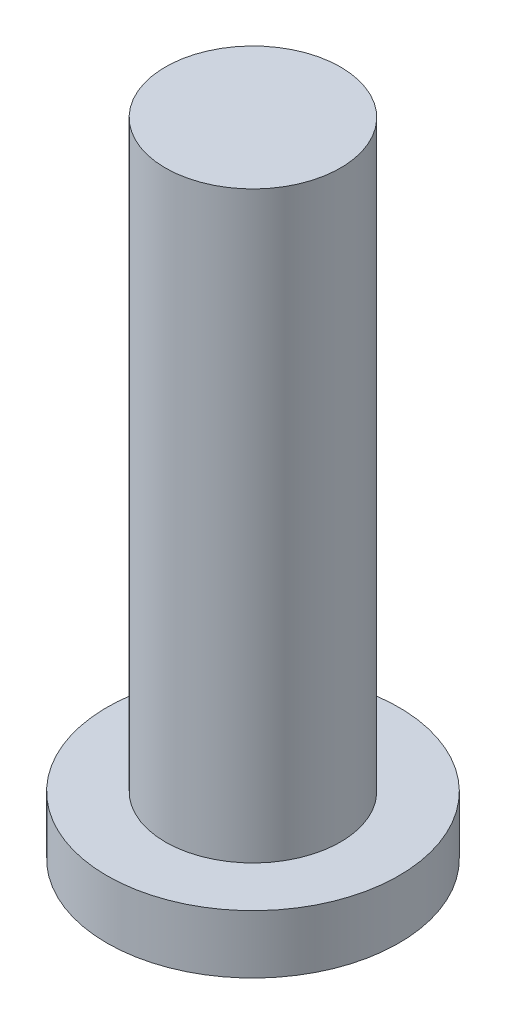
ISO-10303-21;
HEADER;
FILE_DESCRIPTION(('STEP AP214'),'2;1');
FILE_NAME('part.step','',(''),(''),'','','');
FILE_SCHEMA(('AUTOMOTIVE_DESIGN { 1 0 10303 214 1 1 1 1 }'));
ENDSEC;
DATA;
#1=APPLICATION_CONTEXT('core data for automotive mechanical design processes');
#2=APPLICATION_PROTOCOL_DEFINITION('international standard','automotive_design',2000,#1);
#3=PRODUCT_CONTEXT('',#1,'mechanical');
#4=PRODUCT('Part','Part','',(#3));
#5=PRODUCT_RELATED_PRODUCT_CATEGORY('part','',(#4));
#6=PRODUCT_DEFINITION_FORMATION('','',#4);
#7=PRODUCT_DEFINITION_CONTEXT('part definition',#1,'design');
#8=PRODUCT_DEFINITION('design','',#6,#7);
#9=PRODUCT_DEFINITION_SHAPE('','',#8);
#10=(LENGTH_UNIT() NAMED_UNIT(*) SI_UNIT(.MILLI.,.METRE.));
#11=(NAMED_UNIT(*) PLANE_ANGLE_UNIT() SI_UNIT($,.RADIAN.));
#12=(NAMED_UNIT(*) SI_UNIT($,.STERADIAN.) SOLID_ANGLE_UNIT());
#13=UNCERTAINTY_MEASURE_WITH_UNIT(LENGTH_MEASURE(1.E-05),#10,'distance_accuracy_value','');
#14=(GEOMETRIC_REPRESENTATION_CONTEXT(3) GLOBAL_UNCERTAINTY_ASSIGNED_CONTEXT((#13)) GLOBAL_UNIT_ASSIGNED_CONTEXT((#10,
#11,#12)) REPRESENTATION_CONTEXT('',''));
#15=CARTESIAN_POINT('',(0.,0.,0.));
#16=DIRECTION('',(0.,0.,1.));
#17=DIRECTION('',(1.,0.,0.));
#18=AXIS2_PLACEMENT_3D('',#15,#16,#17);
#19=CARTESIAN_POINT('',(0.,5.,0.));
#20=DIRECTION('',(0.,-1.,0.));
#21=DIRECTION('',(0.,0.,-1.));
#22=AXIS2_PLACEMENT_3D('',#19,#20,#21);
#23=CYLINDRICAL_SURFACE('',#22,12.5);
#24=CARTESIAN_POINT('',(0.,5.,0.));
#25=DIRECTION('',(0.,1.,0.));
#26=DIRECTION('',(0.,0.,1.));
#27=AXIS2_PLACEMENT_3D('',#24,#25,#26);
#28=CIRCLE('',#27,12.5);
#29=CARTESIAN_POINT('',(0.,5.,12.5));
#30=VERTEX_POINT('',#29);
#31=EDGE_CURVE('E39',#30,#30,#28,.T.);
#32=ORIENTED_EDGE('',*,*,#31,.F.);
#33=EDGE_LOOP('',(#32));
#34=FACE_BOUND('',#33,.T.);
#35=CARTESIAN_POINT('',(0.,0.,0.));
#36=DIRECTION('',(0.,1.,0.));
#37=DIRECTION('',(0.,0.,1.));
#38=AXIS2_PLACEMENT_3D('',#35,#36,#37);
#39=CIRCLE('',#38,12.5);
#40=CARTESIAN_POINT('',(0.,0.,12.5));
#41=VERTEX_POINT('',#40);
#42=EDGE_CURVE('E35',#41,#41,#39,.T.);
#43=ORIENTED_EDGE('',*,*,#42,.T.);
#44=EDGE_LOOP('',(#43));
#45=FACE_BOUND('',#44,.T.);
#46=ADVANCED_FACE('F32',(#34,#45),#23,.T.);
#47=CARTESIAN_POINT('',(0.,5.,0.));
#48=DIRECTION('',(0.,1.,0.));
#49=DIRECTION('',(0.,0.,1.));
#50=AXIS2_PLACEMENT_3D('',#47,#48,#49);
#51=PLANE('',#50);
#52=CARTESIAN_POINT('',(0.,5.,0.));
#53=DIRECTION('',(0.,1.,0.));
#54=DIRECTION('',(0.,0.,1.));
#55=AXIS2_PLACEMENT_3D('',#52,#53,#54);
#56=CIRCLE('',#55,7.5);
#57=CARTESIAN_POINT('',(0.,5.,7.5));
#58=VERTEX_POINT('',#57);
#59=EDGE_CURVE('E10',#58,#58,#56,.T.);
#60=ORIENTED_EDGE('',*,*,#59,.F.);
#61=EDGE_LOOP('',(#60));
#62=FACE_BOUND('',#61,.T.);
#63=ORIENTED_EDGE('',*,*,#31,.T.);
#64=EDGE_LOOP('',(#63));
#65=FACE_BOUND('',#64,.T.);
#66=ADVANCED_FACE('F56',(#62,#65),#51,.T.);
#67=CARTESIAN_POINT('',(0.,0.,0.));
#68=DIRECTION('',(0.,1.,0.));
#69=DIRECTION('',(0.,0.,1.));
#70=AXIS2_PLACEMENT_3D('',#67,#68,#69);
#71=PLANE('',#70);
#72=ORIENTED_EDGE('',*,*,#42,.F.);
#73=EDGE_LOOP('',(#72));
#74=FACE_BOUND('',#73,.T.);
#75=ADVANCED_FACE('F53',(#74),#71,.F.);
#76=CARTESIAN_POINT('',(0.,55.,0.));
#77=DIRECTION('',(0.,-1.,0.));
#78=DIRECTION('',(0.,0.,-1.));
#79=AXIS2_PLACEMENT_3D('',#76,#77,#78);
#80=CYLINDRICAL_SURFACE('',#79,7.5);
#81=CARTESIAN_POINT('',(0.,55.,0.));
#82=DIRECTION('',(0.,1.,0.));
#83=DIRECTION('',(0.,0.,1.));
#84=AXIS2_PLACEMENT_3D('',#81,#82,#83);
#85=CIRCLE('',#84,7.5);
#86=CARTESIAN_POINT('',(0.,55.,7.5));
#87=VERTEX_POINT('',#86);
#88=EDGE_CURVE('E45',#87,#87,#85,.T.);
#89=ORIENTED_EDGE('',*,*,#88,.F.);
#90=EDGE_LOOP('',(#89));
#91=FACE_BOUND('',#90,.T.);
#92=ORIENTED_EDGE('',*,*,#59,.T.);
#93=EDGE_LOOP('',(#92));
#94=FACE_BOUND('',#93,.T.);
#95=ADVANCED_FACE('F55',(#91,#94),#80,.T.);
#96=CARTESIAN_POINT('',(0.,55.,0.));
#97=DIRECTION('',(0.,1.,0.));
#98=DIRECTION('',(0.,0.,1.));
#99=AXIS2_PLACEMENT_3D('',#96,#97,#98);
#100=PLANE('',#99);
#101=ORIENTED_EDGE('',*,*,#88,.T.);
#102=EDGE_LOOP('',(#101));
#103=FACE_BOUND('',#102,.T.);
#104=ADVANCED_FACE('F61',(#103),#100,.T.);
#105=CLOSED_SHELL('',(#46,#66,#75,#95,#104));
#106=MANIFOLD_SOLID_BREP('B2',#105);
#107=ADVANCED_BREP_SHAPE_REPRESENTATION('',(#18,#106),#14);
#108=SHAPE_DEFINITION_REPRESENTATION(#9,#107);
ENDSEC;
END-ISO-10303-21;
